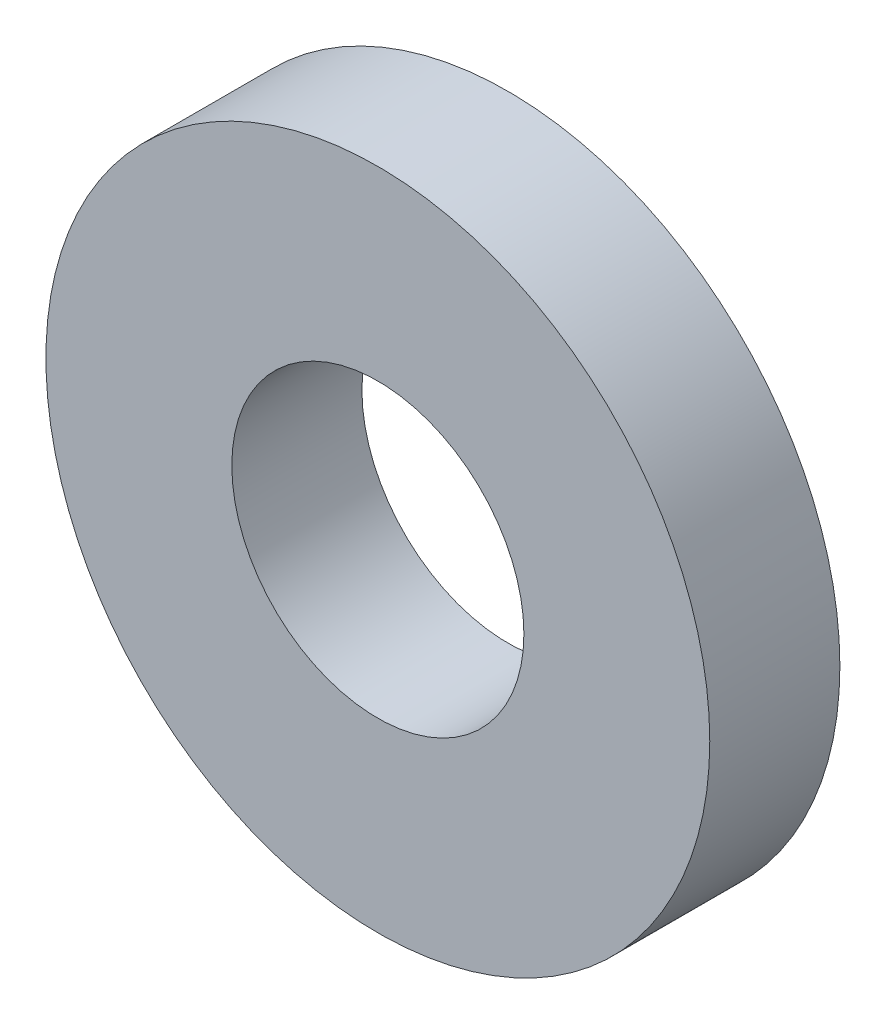
ISO-10303-21;
HEADER;
FILE_DESCRIPTION(('STEP AP214'),'2;1');
FILE_NAME('part.step','',(''),(''),'','','');
FILE_SCHEMA(('AUTOMOTIVE_DESIGN { 1 0 10303 214 1 1 1 1 }'));
ENDSEC;
DATA;
#1=APPLICATION_CONTEXT('core data for automotive mechanical design processes');
#2=APPLICATION_PROTOCOL_DEFINITION('international standard','automotive_design',2000,#1);
#3=PRODUCT_CONTEXT('',#1,'mechanical');
#4=PRODUCT('Part','Part','',(#3));
#5=PRODUCT_RELATED_PRODUCT_CATEGORY('part','',(#4));
#6=PRODUCT_DEFINITION_FORMATION('','',#4);
#7=PRODUCT_DEFINITION_CONTEXT('part definition',#1,'design');
#8=PRODUCT_DEFINITION('design','',#6,#7);
#9=PRODUCT_DEFINITION_SHAPE('','',#8);
#10=(LENGTH_UNIT() NAMED_UNIT(*) SI_UNIT(.MILLI.,.METRE.));
#11=(NAMED_UNIT(*) PLANE_ANGLE_UNIT() SI_UNIT($,.RADIAN.));
#12=(NAMED_UNIT(*) SI_UNIT($,.STERADIAN.) SOLID_ANGLE_UNIT());
#13=UNCERTAINTY_MEASURE_WITH_UNIT(LENGTH_MEASURE(1.E-05),#10,'distance_accuracy_value','');
#14=(GEOMETRIC_REPRESENTATION_CONTEXT(3) GLOBAL_UNCERTAINTY_ASSIGNED_CONTEXT((#13)) GLOBAL_UNIT_ASSIGNED_CONTEXT((#10,
#11,#12)) REPRESENTATION_CONTEXT('',''));
#15=CARTESIAN_POINT('',(0.,0.,0.));
#16=DIRECTION('',(0.,0.,1.));
#17=DIRECTION('',(1.,0.,0.));
#18=AXIS2_PLACEMENT_3D('',#15,#16,#17);
#19=CARTESIAN_POINT('',(0.,0.,3.1115));
#20=DIRECTION('',(0.,0.,1.));
#21=DIRECTION('',(1.,0.,0.));
#22=AXIS2_PLACEMENT_3D('',#19,#20,#21);
#23=PLANE('',#22);
#24=CARTESIAN_POINT('',(0.,0.,3.1115));
#25=DIRECTION('',(0.,0.,1.));
#26=DIRECTION('',(1.,0.,0.));
#27=AXIS2_PLACEMENT_3D('',#24,#25,#26);
#28=CIRCLE('',#27,7.9375);
#29=CARTESIAN_POINT('',(7.9375,0.,3.1115));
#30=VERTEX_POINT('',#29);
#31=EDGE_CURVE('E10',#30,#30,#28,.T.);
#32=ORIENTED_EDGE('',*,*,#31,.T.);
#33=EDGE_LOOP('',(#32));
#34=FACE_BOUND('',#33,.T.);
#35=CARTESIAN_POINT('',(0.,0.,3.1115));
#36=DIRECTION('',(0.,0.,1.));
#37=DIRECTION('',(1.,0.,0.));
#38=AXIS2_PLACEMENT_3D('',#35,#36,#37);
#39=CIRCLE('',#38,3.4925);
#40=CARTESIAN_POINT('',(3.4925,0.,3.1115));
#41=VERTEX_POINT('',#40);
#42=EDGE_CURVE('E48',#41,#41,#39,.T.);
#43=ORIENTED_EDGE('',*,*,#42,.F.);
#44=EDGE_LOOP('',(#43));
#45=FACE_BOUND('',#44,.T.);
#46=ADVANCED_FACE('F37',(#34,#45),#23,.T.);
#47=CARTESIAN_POINT('',(0.,0.,0.));
#48=DIRECTION('',(0.,0.,1.));
#49=DIRECTION('',(1.,0.,0.));
#50=AXIS2_PLACEMENT_3D('',#47,#48,#49);
#51=PLANE('',#50);
#52=CARTESIAN_POINT('',(0.,0.,0.));
#53=DIRECTION('',(0.,0.,1.));
#54=DIRECTION('',(1.,0.,0.));
#55=AXIS2_PLACEMENT_3D('',#52,#53,#54);
#56=CIRCLE('',#55,7.9375);
#57=CARTESIAN_POINT('',(7.9375,0.,0.));
#58=VERTEX_POINT('',#57);
#59=EDGE_CURVE('E41',#58,#58,#56,.T.);
#60=ORIENTED_EDGE('',*,*,#59,.F.);
#61=EDGE_LOOP('',(#60));
#62=FACE_BOUND('',#61,.T.);
#63=CARTESIAN_POINT('',(0.,0.,0.));
#64=DIRECTION('',(0.,0.,1.));
#65=DIRECTION('',(1.,0.,0.));
#66=AXIS2_PLACEMENT_3D('',#63,#64,#65);
#67=CIRCLE('',#66,3.4925);
#68=CARTESIAN_POINT('',(3.4925,0.,0.));
#69=VERTEX_POINT('',#68);
#70=EDGE_CURVE('E50',#69,#69,#67,.T.);
#71=ORIENTED_EDGE('',*,*,#70,.T.);
#72=EDGE_LOOP('',(#71));
#73=FACE_BOUND('',#72,.T.);
#74=ADVANCED_FACE('F60',(#62,#73),#51,.F.);
#75=CARTESIAN_POINT('',(0.,0.,3.1115));
#76=DIRECTION('',(0.,0.,-1.));
#77=DIRECTION('',(-1.,0.,0.));
#78=AXIS2_PLACEMENT_3D('',#75,#76,#77);
#79=CYLINDRICAL_SURFACE('',#78,7.9375);
#80=ORIENTED_EDGE('',*,*,#31,.F.);
#81=EDGE_LOOP('',(#80));
#82=FACE_BOUND('',#81,.T.);
#83=ORIENTED_EDGE('',*,*,#59,.T.);
#84=EDGE_LOOP('',(#83));
#85=FACE_BOUND('',#84,.T.);
#86=ADVANCED_FACE('F39',(#82,#85),#79,.T.);
#87=CARTESIAN_POINT('',(0.,0.,3.1115));
#88=DIRECTION('',(0.,0.,-1.));
#89=DIRECTION('',(-1.,0.,0.));
#90=AXIS2_PLACEMENT_3D('',#87,#88,#89);
#91=CYLINDRICAL_SURFACE('',#90,3.4925);
#92=ORIENTED_EDGE('',*,*,#42,.T.);
#93=EDGE_LOOP('',(#92));
#94=FACE_BOUND('',#93,.T.);
#95=ORIENTED_EDGE('',*,*,#70,.F.);
#96=EDGE_LOOP('',(#95));
#97=FACE_BOUND('',#96,.T.);
#98=ADVANCED_FACE('F56',(#94,#97),#91,.F.);
#99=CLOSED_SHELL('',(#46,#74,#86,#98));
#100=MANIFOLD_SOLID_BREP('B2',#99);
#101=ADVANCED_BREP_SHAPE_REPRESENTATION('',(#18,#100),#14);
#102=SHAPE_DEFINITION_REPRESENTATION(#9,#101);
ENDSEC;
END-ISO-10303-21;
